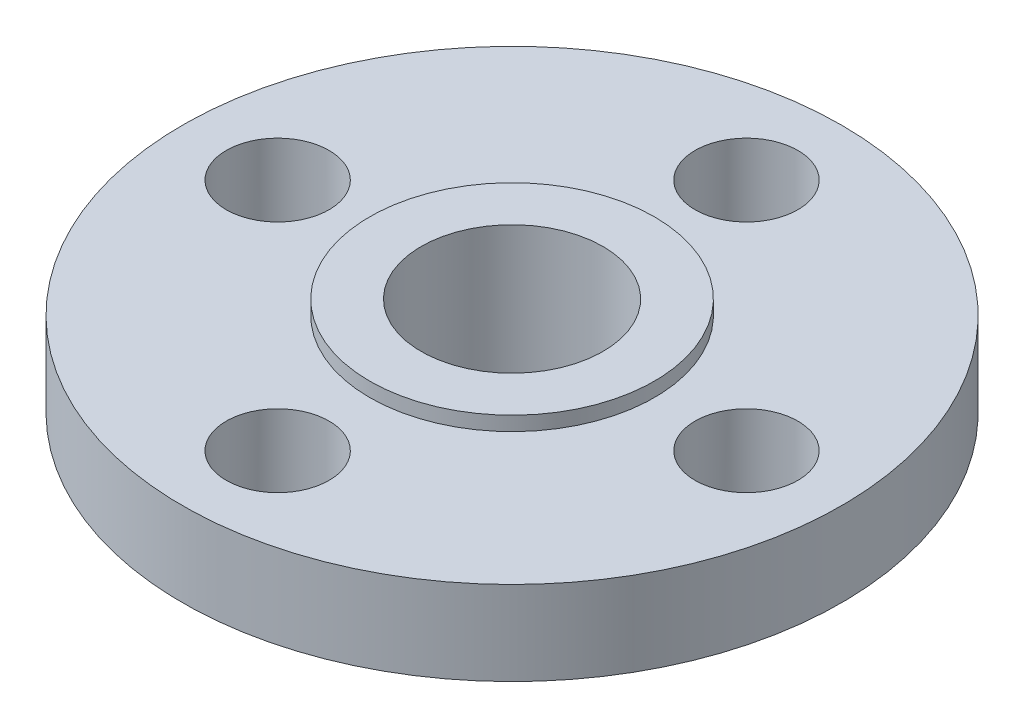
ISO-10303-21;
HEADER;
FILE_DESCRIPTION(('STEP AP214'),'2;1');
FILE_NAME('part.step','',(''),(''),'','','');
FILE_SCHEMA(('AUTOMOTIVE_DESIGN { 1 0 10303 214 1 1 1 1 }'));
ENDSEC;
DATA;
#1=APPLICATION_CONTEXT('core data for automotive mechanical design processes');
#2=APPLICATION_PROTOCOL_DEFINITION('international standard','automotive_design',2000,#1);
#3=PRODUCT_CONTEXT('',#1,'mechanical');
#4=PRODUCT('Part','Part','',(#3));
#5=PRODUCT_RELATED_PRODUCT_CATEGORY('part','',(#4));
#6=PRODUCT_DEFINITION_FORMATION('','',#4);
#7=PRODUCT_DEFINITION_CONTEXT('part definition',#1,'design');
#8=PRODUCT_DEFINITION('design','',#6,#7);
#9=PRODUCT_DEFINITION_SHAPE('','',#8);
#10=(LENGTH_UNIT() NAMED_UNIT(*) SI_UNIT(.MILLI.,.METRE.));
#11=(NAMED_UNIT(*) PLANE_ANGLE_UNIT() SI_UNIT($,.RADIAN.));
#12=(NAMED_UNIT(*) SI_UNIT($,.STERADIAN.) SOLID_ANGLE_UNIT());
#13=UNCERTAINTY_MEASURE_WITH_UNIT(LENGTH_MEASURE(1.E-05),#10,'distance_accuracy_value','');
#14=(GEOMETRIC_REPRESENTATION_CONTEXT(3) GLOBAL_UNCERTAINTY_ASSIGNED_CONTEXT((#13)) GLOBAL_UNIT_ASSIGNED_CONTEXT((#10,
#11,#12)) REPRESENTATION_CONTEXT('',''));
#15=CARTESIAN_POINT('',(0.,0.,0.));
#16=DIRECTION('',(0.,0.,1.));
#17=DIRECTION('',(1.,0.,0.));
#18=AXIS2_PLACEMENT_3D('',#15,#16,#17);
#19=CARTESIAN_POINT('',(0.,0.,0.));
#20=DIRECTION('',(0.,-1.,0.));
#21=DIRECTION('',(0.,0.,-1.));
#22=AXIS2_PLACEMENT_3D('',#19,#20,#21);
#23=CYLINDRICAL_SURFACE('',#22,35.);
#24=CARTESIAN_POINT('',(0.,0.,0.));
#25=DIRECTION('',(0.,-1.,0.));
#26=DIRECTION('',(0.,0.,-1.));
#27=AXIS2_PLACEMENT_3D('',#24,#25,#26);
#28=CIRCLE('',#27,35.);
#29=CARTESIAN_POINT('',(-34.9352080989876,0.,-2.12866979130851));
#30=VERTEX_POINT('',#29);
#31=CARTESIAN_POINT('',(-2.12866979130833,0.,-34.9352080989876));
#32=VERTEX_POINT('',#31);
#33=EDGE_CURVE('E146',#30,#32,#28,.T.);
#34=ORIENTED_EDGE('',*,*,#33,.F.);
#35=DIRECTION('',(0.,1.,0.));
#36=VECTOR('',#35,1.);
#37=CARTESIAN_POINT('',(-34.9352080989876,11.15,-2.12866979130841));
#38=LINE('',#37,#36);
#39=CARTESIAN_POINT('',(-34.9352080989876,6.35,-2.12866979130841));
#40=VERTEX_POINT('',#39);
#41=EDGE_CURVE('E245',#30,#40,#38,.T.);
#42=ORIENTED_EDGE('',*,*,#41,.T.);
#43=CARTESIAN_POINT('',(0.,6.35,0.));
#44=DIRECTION('',(0.,-1.,0.));
#45=DIRECTION('',(0.,0.,-1.));
#46=AXIS2_PLACEMENT_3D('',#43,#44,#45);
#47=CIRCLE('',#46,35.);
#48=CARTESIAN_POINT('',(-2.12866979130828,6.35,-34.9352080989876));
#49=VERTEX_POINT('',#48);
#50=EDGE_CURVE('E280',#40,#49,#47,.T.);
#51=ORIENTED_EDGE('',*,*,#50,.T.);
#52=DIRECTION('',(0.,1.,0.));
#53=VECTOR('',#52,1.);
#54=CARTESIAN_POINT('',(-2.12866979130829,11.15,-34.9352080989876));
#55=LINE('',#54,#53);
#56=EDGE_CURVE('E61',#49,#32,#55,.F.);
#57=ORIENTED_EDGE('',*,*,#56,.T.);
#58=EDGE_LOOP('',(#34,#42,#51,#57));
#59=FACE_BOUND('',#58,.T.);
#60=ADVANCED_FACE('F45',(#59),#23,.T.);
#61=CARTESIAN_POINT('',(2.12866979130857,0.,-34.9352080989876));
#62=VERTEX_POINT('',#61);
#63=CARTESIAN_POINT('',(34.9352080989876,0.,-2.12866979130826));
#64=VERTEX_POINT('',#63);
#65=EDGE_CURVE('E140',#62,#64,#28,.T.);
#66=ORIENTED_EDGE('',*,*,#65,.F.);
#67=DIRECTION('',(0.,1.,0.));
#68=VECTOR('',#67,1.);
#69=CARTESIAN_POINT('',(2.12866979130853,11.15,-34.9352080989876));
#70=LINE('',#69,#68);
#71=CARTESIAN_POINT('',(2.12866979130853,6.35,-34.9352080989876));
#72=VERTEX_POINT('',#71);
#73=EDGE_CURVE('E259',#62,#72,#70,.T.);
#74=ORIENTED_EDGE('',*,*,#73,.T.);
#75=CARTESIAN_POINT('',(34.9352080989877,6.35,-2.12866979130816));
#76=VERTEX_POINT('',#75);
#77=EDGE_CURVE('E149',#72,#76,#47,.T.);
#78=ORIENTED_EDGE('',*,*,#77,.T.);
#79=DIRECTION('',(0.,1.,0.));
#80=VECTOR('',#79,1.);
#81=CARTESIAN_POINT('',(34.9352080989876,11.15,-2.12866979130817));
#82=LINE('',#81,#80);
#83=EDGE_CURVE('E307',#76,#64,#82,.F.);
#84=ORIENTED_EDGE('',*,*,#83,.T.);
#85=EDGE_LOOP('',(#66,#74,#78,#84));
#86=FACE_BOUND('',#85,.T.);
#87=ADVANCED_FACE('F196',(#86),#23,.T.);
#88=CARTESIAN_POINT('',(34.9352080989876,0.,2.12866979130875));
#89=VERTEX_POINT('',#88);
#90=CARTESIAN_POINT('',(2.12866979130813,0.,34.9352080989877));
#91=VERTEX_POINT('',#90);
#92=EDGE_CURVE('E129',#89,#91,#28,.T.);
#93=ORIENTED_EDGE('',*,*,#92,.F.);
#94=DIRECTION('',(0.,1.,0.));
#95=VECTOR('',#94,1.);
#96=CARTESIAN_POINT('',(34.9352080989876,11.15,2.12866979130866));
#97=LINE('',#96,#95);
#98=CARTESIAN_POINT('',(34.9352080989876,6.35,2.12866979130865));
#99=VERTEX_POINT('',#98);
#100=EDGE_CURVE('E302',#89,#99,#97,.T.);
#101=ORIENTED_EDGE('',*,*,#100,.T.);
#102=CARTESIAN_POINT('',(2.12866979130804,6.35,34.9352080989877));
#103=VERTEX_POINT('',#102);
#104=EDGE_CURVE('E131',#99,#103,#47,.T.);
#105=ORIENTED_EDGE('',*,*,#104,.T.);
#106=DIRECTION('',(0.,1.,0.));
#107=VECTOR('',#106,1.);
#108=CARTESIAN_POINT('',(2.12866979130805,11.15,34.9352080989876));
#109=LINE('',#108,#107);
#110=EDGE_CURVE('E113',#103,#91,#109,.F.);
#111=ORIENTED_EDGE('',*,*,#110,.T.);
#112=EDGE_LOOP('',(#93,#101,#105,#111));
#113=FACE_BOUND('',#112,.T.);
#114=ADVANCED_FACE('F127',(#113),#23,.T.);
#115=CARTESIAN_POINT('',(0.,0.,0.));
#116=DIRECTION('',(0.,-1.,0.));
#117=DIRECTION('',(0.,0.,-1.));
#118=AXIS2_PLACEMENT_3D('',#115,#116,#117);
#119=CYLINDRICAL_SURFACE('',#118,17.25);
#120=CARTESIAN_POINT('',(0.,25.,0.));
#121=DIRECTION('',(0.,-1.,0.));
#122=DIRECTION('',(0.,0.,-1.));
#123=AXIS2_PLACEMENT_3D('',#120,#121,#122);
#124=CIRCLE('',#123,17.25);
#125=CARTESIAN_POINT('',(0.,25.,-17.25));
#126=VERTEX_POINT('',#125);
#127=EDGE_CURVE('E257',#126,#126,#124,.T.);
#128=ORIENTED_EDGE('',*,*,#127,.F.);
#129=EDGE_LOOP('',(#128));
#130=FACE_BOUND('',#129,.T.);
#131=CARTESIAN_POINT('',(0.,0.,0.));
#132=DIRECTION('',(0.,-1.,0.));
#133=DIRECTION('',(0.,0.,-1.));
#134=AXIS2_PLACEMENT_3D('',#131,#132,#133);
#135=CIRCLE('',#134,17.25);
#136=CARTESIAN_POINT('',(0.,0.,-17.25));
#137=VERTEX_POINT('',#136);
#138=EDGE_CURVE('E11',#137,#137,#135,.T.);
#139=ORIENTED_EDGE('',*,*,#138,.T.);
#140=EDGE_LOOP('',(#139));
#141=FACE_BOUND('',#140,.T.);
#142=ADVANCED_FACE('F47',(#130,#141),#119,.F.);
#143=CARTESIAN_POINT('',(-17.25,0.,0.));
#144=DIRECTION('',(0.,1.,0.));
#145=DIRECTION('',(0.,0.,1.));
#146=AXIS2_PLACEMENT_3D('',#143,#144,#145);
#147=PLANE('',#146);
#148=ORIENTED_EDGE('',*,*,#138,.F.);
#149=EDGE_LOOP('',(#148));
#150=FACE_BOUND('',#149,.T.);
#151=CARTESIAN_POINT('',(0.,0.,0.));
#152=DIRECTION('',(0.,-1.,0.));
#153=DIRECTION('',(0.,0.,-1.));
#154=AXIS2_PLACEMENT_3D('',#151,#152,#153);
#155=CIRCLE('',#154,21.4596460176991);
#156=CARTESIAN_POINT('',(0.,0.,-21.4596460176991));
#157=VERTEX_POINT('',#156);
#158=EDGE_CURVE('E54',#157,#157,#155,.T.);
#159=ORIENTED_EDGE('',*,*,#158,.T.);
#160=EDGE_LOOP('',(#159));
#161=FACE_BOUND('',#160,.T.);
#162=ADVANCED_FACE('F165',(#150,#161),#147,.F.);
#163=CARTESIAN_POINT('',(0.,5.84520581942299,0.));
#164=DIRECTION('',(0.,1.,0.));
#165=DIRECTION('',(0.,0.,1.));
#166=AXIS2_PLACEMENT_3D('',#163,#164,#165);
#167=CONICAL_SURFACE('',#166,23.940788683606,0.4014257279587);
#168=ORIENTED_EDGE('',*,*,#158,.F.);
#169=EDGE_LOOP('',(#168));
#170=FACE_BOUND('',#169,.T.);
#171=CARTESIAN_POINT('',(0.,5.84520581942299,0.));
#172=DIRECTION('',(0.,-1.,0.));
#173=DIRECTION('',(0.,0.,-1.));
#174=AXIS2_PLACEMENT_3D('',#171,#172,#173);
#175=CIRCLE('',#174,23.940788683606);
#176=CARTESIAN_POINT('',(0.,5.84520581942299,-23.940788683606));
#177=VERTEX_POINT('',#176);
#178=EDGE_CURVE('E158',#177,#177,#175,.T.);
#179=ORIENTED_EDGE('',*,*,#178,.T.);
#180=EDGE_LOOP('',(#179));
#181=FACE_BOUND('',#180,.T.);
#182=ADVANCED_FACE('F167',(#170,#181),#167,.T.);
#183=CARTESIAN_POINT('',(-23.940788683606,5.84520581942299,0.));
#184=DIRECTION('',(0.,1.,0.));
#185=DIRECTION('',(0.,0.,1.));
#186=AXIS2_PLACEMENT_3D('',#183,#184,#185);
#187=PLANE('',#186);
#188=ORIENTED_EDGE('',*,*,#178,.F.);
#189=EDGE_LOOP('',(#188));
#190=FACE_BOUND('',#189,.T.);
#191=CARTESIAN_POINT('',(0.,5.84520581942299,0.));
#192=DIRECTION('',(0.,-1.,0.));
#193=DIRECTION('',(0.,0.,-1.));
#194=AXIS2_PLACEMENT_3D('',#191,#192,#193);
#195=CIRCLE('',#194,27.7185033517922);
#196=CARTESIAN_POINT('',(0.,5.84520581942299,-27.7185033517922));
#197=VERTEX_POINT('',#196);
#198=EDGE_CURVE('E154',#197,#197,#195,.T.);
#199=ORIENTED_EDGE('',*,*,#198,.T.);
#200=EDGE_LOOP('',(#199));
#201=FACE_BOUND('',#200,.T.);
#202=ADVANCED_FACE('F170',(#190,#201),#187,.F.);
#203=CARTESIAN_POINT('',(0.,0.,0.));
#204=DIRECTION('',(0.,-1.,0.));
#205=DIRECTION('',(0.,0.,-1.));
#206=AXIS2_PLACEMENT_3D('',#203,#204,#205);
#207=CONICAL_SURFACE('',#206,30.1996460176991,0.401425727958693);
#208=ORIENTED_EDGE('',*,*,#198,.F.);
#209=EDGE_LOOP('',(#208));
#210=FACE_BOUND('',#209,.T.);
#211=CARTESIAN_POINT('',(0.,0.,0.));
#212=DIRECTION('',(0.,-1.,0.));
#213=DIRECTION('',(0.,0.,-1.));
#214=AXIS2_PLACEMENT_3D('',#211,#212,#213);
#215=CIRCLE('',#214,30.1996460176991);
#216=CARTESIAN_POINT('',(0.,0.,-30.1996460176991));
#217=VERTEX_POINT('',#216);
#218=EDGE_CURVE('E145',#217,#217,#215,.T.);
#219=ORIENTED_EDGE('',*,*,#218,.T.);
#220=EDGE_LOOP('',(#219));
#221=FACE_BOUND('',#220,.T.);
#222=ADVANCED_FACE('F176',(#210,#221),#207,.F.);
#223=CARTESIAN_POINT('',(-30.1996460176991,0.,0.));
#224=DIRECTION('',(0.,1.,0.));
#225=DIRECTION('',(0.,0.,1.));
#226=AXIS2_PLACEMENT_3D('',#223,#224,#225);
#227=PLANE('',#226);
#228=ORIENTED_EDGE('',*,*,#218,.F.);
#229=EDGE_LOOP('',(#228));
#230=FACE_BOUND('',#229,.T.);
#231=CARTESIAN_POINT('',(-2.12866979130887,0.,34.9352080989876));
#232=VERTEX_POINT('',#231);
#233=CARTESIAN_POINT('',(-34.9352080989876,0.,2.12866979130851));
#234=VERTEX_POINT('',#233);
#235=EDGE_CURVE('E141',#232,#234,#28,.T.);
#236=ORIENTED_EDGE('',*,*,#235,.T.);
#237=CARTESIAN_POINT('',(-44.45,0.,0.));
#238=DIRECTION('',(0.,1.,0.));
#239=DIRECTION('',(0.,0.,1.));
#240=AXIS2_PLACEMENT_3D('',#237,#238,#239);
#241=CIRCLE('',#240,9.75);
#242=EDGE_CURVE('E243',#234,#30,#241,.T.);
#243=ORIENTED_EDGE('',*,*,#242,.T.);
#244=ORIENTED_EDGE('',*,*,#33,.T.);
#245=CARTESIAN_POINT('',(1.55196345511577E-13,0.,-44.45));
#246=DIRECTION('',(0.,1.,0.));
#247=DIRECTION('',(0.,0.,1.));
#248=AXIS2_PLACEMENT_3D('',#245,#246,#247);
#249=CIRCLE('',#248,9.75);
#250=EDGE_CURVE('E295',#32,#62,#249,.T.);
#251=ORIENTED_EDGE('',*,*,#250,.T.);
#252=ORIENTED_EDGE('',*,*,#65,.T.);
#253=CARTESIAN_POINT('',(44.45,0.,3.10392691023155E-13));
#254=DIRECTION('',(0.,1.,0.));
#255=DIRECTION('',(0.,0.,1.));
#256=AXIS2_PLACEMENT_3D('',#253,#254,#255);
#257=CIRCLE('',#256,9.75);
#258=EDGE_CURVE('E138',#64,#89,#257,.T.);
#259=ORIENTED_EDGE('',*,*,#258,.T.);
#260=ORIENTED_EDGE('',*,*,#92,.T.);
#261=CARTESIAN_POINT('',(-4.65589036534732E-13,0.,44.45));
#262=DIRECTION('',(0.,1.,0.));
#263=DIRECTION('',(0.,0.,1.));
#264=AXIS2_PLACEMENT_3D('',#261,#262,#263);
#265=CIRCLE('',#264,9.75);
#266=EDGE_CURVE('E110',#91,#232,#265,.T.);
#267=ORIENTED_EDGE('',*,*,#266,.T.);
#268=EDGE_LOOP('',(#236,#243,#244,#251,#252,#259,#260,#267));
#269=FACE_BOUND('',#268,.T.);
#270=ADVANCED_FACE('F136',(#230,#269),#227,.F.);
#271=CARTESIAN_POINT('',(-2.12866979130877,6.35,34.9352080989876));
#272=VERTEX_POINT('',#271);
#273=CARTESIAN_POINT('',(-34.9352080989876,6.35,2.12866979130841));
#274=VERTEX_POINT('',#273);
#275=EDGE_CURVE('E251',#272,#274,#47,.T.);
#276=ORIENTED_EDGE('',*,*,#275,.T.);
#277=DIRECTION('',(0.,1.,0.));
#278=VECTOR('',#277,1.);
#279=CARTESIAN_POINT('',(-34.9352080989876,11.15,2.12866979130841));
#280=LINE('',#279,#278);
#281=EDGE_CURVE('E69',#274,#234,#280,.F.);
#282=ORIENTED_EDGE('',*,*,#281,.T.);
#283=ORIENTED_EDGE('',*,*,#235,.F.);
#284=DIRECTION('',(0.,1.,0.));
#285=VECTOR('',#284,1.);
#286=CARTESIAN_POINT('',(-2.12866979130878,11.15,34.9352080989876));
#287=LINE('',#286,#285);
#288=EDGE_CURVE('E116',#232,#272,#287,.T.);
#289=ORIENTED_EDGE('',*,*,#288,.T.);
#290=EDGE_LOOP('',(#276,#282,#283,#289));
#291=FACE_BOUND('',#290,.T.);
#292=ADVANCED_FACE('F186',(#291),#23,.T.);
#293=CARTESIAN_POINT('',(-35.,6.35,0.));
#294=DIRECTION('',(0.,1.,0.));
#295=DIRECTION('',(0.,0.,1.));
#296=AXIS2_PLACEMENT_3D('',#293,#294,#295);
#297=PLANE('',#296);
#298=ORIENTED_EDGE('',*,*,#50,.F.);
#299=CARTESIAN_POINT('',(-44.45,6.35,0.));
#300=DIRECTION('',(0.,1.,0.));
#301=DIRECTION('',(0.,0.,1.));
#302=AXIS2_PLACEMENT_3D('',#299,#300,#301);
#303=CIRCLE('',#302,9.75);
#304=EDGE_CURVE('E253',#40,#274,#303,.T.);
#305=ORIENTED_EDGE('',*,*,#304,.T.);
#306=ORIENTED_EDGE('',*,*,#275,.F.);
#307=CARTESIAN_POINT('',(-4.65589036534732E-13,6.35,44.45));
#308=DIRECTION('',(0.,1.,0.));
#309=DIRECTION('',(0.,0.,1.));
#310=AXIS2_PLACEMENT_3D('',#307,#308,#309);
#311=CIRCLE('',#310,9.75);
#312=EDGE_CURVE('E133',#272,#103,#311,.T.);
#313=ORIENTED_EDGE('',*,*,#312,.T.);
#314=ORIENTED_EDGE('',*,*,#104,.F.);
#315=CARTESIAN_POINT('',(44.45,6.35,3.10392691023155E-13));
#316=DIRECTION('',(0.,1.,0.));
#317=DIRECTION('',(0.,0.,1.));
#318=AXIS2_PLACEMENT_3D('',#315,#316,#317);
#319=CIRCLE('',#318,9.75);
#320=EDGE_CURVE('E310',#99,#76,#319,.T.);
#321=ORIENTED_EDGE('',*,*,#320,.T.);
#322=ORIENTED_EDGE('',*,*,#77,.F.);
#323=CARTESIAN_POINT('',(1.55196345511577E-13,6.35,-44.45));
#324=DIRECTION('',(0.,1.,0.));
#325=DIRECTION('',(0.,0.,1.));
#326=AXIS2_PLACEMENT_3D('',#323,#324,#325);
#327=CIRCLE('',#326,9.75);
#328=EDGE_CURVE('E298',#72,#49,#327,.T.);
#329=ORIENTED_EDGE('',*,*,#328,.T.);
#330=EDGE_LOOP('',(#298,#305,#306,#313,#314,#321,#322,#329));
#331=FACE_BOUND('',#330,.T.);
#332=CARTESIAN_POINT('',(0.,6.35,0.));
#333=DIRECTION('',(0.,-1.,0.));
#334=DIRECTION('',(0.,0.,-1.));
#335=AXIS2_PLACEMENT_3D('',#332,#333,#334);
#336=CIRCLE('',#335,62.5);
#337=CARTESIAN_POINT('',(0.,6.35,-62.5));
#338=VERTEX_POINT('',#337);
#339=EDGE_CURVE('E277',#338,#338,#336,.T.);
#340=ORIENTED_EDGE('',*,*,#339,.T.);
#341=EDGE_LOOP('',(#340));
#342=FACE_BOUND('',#341,.T.);
#343=ADVANCED_FACE('F192',(#331,#342),#297,.F.);
#344=CARTESIAN_POINT('',(0.,0.,0.));
#345=DIRECTION('',(0.,-1.,0.));
#346=DIRECTION('',(0.,0.,-1.));
#347=AXIS2_PLACEMENT_3D('',#344,#345,#346);
#348=CYLINDRICAL_SURFACE('',#347,62.5);
#349=ORIENTED_EDGE('',*,*,#339,.F.);
#350=EDGE_LOOP('',(#349));
#351=FACE_BOUND('',#350,.T.);
#352=CARTESIAN_POINT('',(0.,22.3,0.));
#353=DIRECTION('',(0.,-1.,0.));
#354=DIRECTION('',(0.,0.,-1.));
#355=AXIS2_PLACEMENT_3D('',#352,#353,#354);
#356=CIRCLE('',#355,62.5);
#357=CARTESIAN_POINT('',(0.,22.3,-62.5));
#358=VERTEX_POINT('',#357);
#359=EDGE_CURVE('E274',#358,#358,#356,.T.);
#360=ORIENTED_EDGE('',*,*,#359,.T.);
#361=EDGE_LOOP('',(#360));
#362=FACE_BOUND('',#361,.T.);
#363=ADVANCED_FACE('F207',(#351,#362),#348,.T.);
#364=CARTESIAN_POINT('',(-62.5,22.3,0.));
#365=DIRECTION('',(0.,-1.,0.));
#366=DIRECTION('',(0.,0.,-1.));
#367=AXIS2_PLACEMENT_3D('',#364,#365,#366);
#368=PLANE('',#367);
#369=CARTESIAN_POINT('',(-44.45,22.3,0.));
#370=DIRECTION('',(0.,1.,0.));
#371=DIRECTION('',(0.,0.,1.));
#372=AXIS2_PLACEMENT_3D('',#369,#370,#371);
#373=CIRCLE('',#372,9.75);
#374=CARTESIAN_POINT('',(-44.45,22.3,9.75));
#375=VERTEX_POINT('',#374);
#376=EDGE_CURVE('E241',#375,#375,#373,.T.);
#377=ORIENTED_EDGE('',*,*,#376,.F.);
#378=EDGE_LOOP('',(#377));
#379=FACE_BOUND('',#378,.T.);
#380=CARTESIAN_POINT('',(1.55196345511577E-13,22.3,-44.45));
#381=DIRECTION('',(0.,1.,0.));
#382=DIRECTION('',(0.,0.,1.));
#383=AXIS2_PLACEMENT_3D('',#380,#381,#382);
#384=CIRCLE('',#383,9.75);
#385=CARTESIAN_POINT('',(1.55196345511577E-13,22.3,-34.7));
#386=VERTEX_POINT('',#385);
#387=EDGE_CURVE('E329',#386,#386,#384,.T.);
#388=ORIENTED_EDGE('',*,*,#387,.F.);
#389=EDGE_LOOP('',(#388));
#390=FACE_BOUND('',#389,.T.);
#391=CARTESIAN_POINT('',(44.45,22.3,3.10392691023155E-13));
#392=DIRECTION('',(0.,1.,0.));
#393=DIRECTION('',(0.,0.,1.));
#394=AXIS2_PLACEMENT_3D('',#391,#392,#393);
#395=CIRCLE('',#394,9.75);
#396=CARTESIAN_POINT('',(44.45,22.3,9.75000000000031));
#397=VERTEX_POINT('',#396);
#398=EDGE_CURVE('E323',#397,#397,#395,.T.);
#399=ORIENTED_EDGE('',*,*,#398,.F.);
#400=EDGE_LOOP('',(#399));
#401=FACE_BOUND('',#400,.T.);
#402=CARTESIAN_POINT('',(-4.65589036534732E-13,22.3,44.45));
#403=DIRECTION('',(0.,1.,0.));
#404=DIRECTION('',(0.,0.,1.));
#405=AXIS2_PLACEMENT_3D('',#402,#403,#404);
#406=CIRCLE('',#405,9.75);
#407=CARTESIAN_POINT('',(-4.65589036534732E-13,22.3,54.2));
#408=VERTEX_POINT('',#407);
#409=EDGE_CURVE('E122',#408,#408,#406,.T.);
#410=ORIENTED_EDGE('',*,*,#409,.F.);
#411=EDGE_LOOP('',(#410));
#412=FACE_BOUND('',#411,.T.);
#413=ORIENTED_EDGE('',*,*,#359,.F.);
#414=EDGE_LOOP('',(#413));
#415=FACE_BOUND('',#414,.T.);
#416=CARTESIAN_POINT('',(0.,22.3,0.));
#417=DIRECTION('',(0.,-1.,0.));
#418=DIRECTION('',(0.,0.,-1.));
#419=AXIS2_PLACEMENT_3D('',#416,#417,#418);
#420=CIRCLE('',#419,27.);
#421=CARTESIAN_POINT('',(0.,22.3,-27.));
#422=VERTEX_POINT('',#421);
#423=EDGE_CURVE('E270',#422,#422,#420,.T.);
#424=ORIENTED_EDGE('',*,*,#423,.T.);
#425=EDGE_LOOP('',(#424));
#426=FACE_BOUND('',#425,.T.);
#427=ADVANCED_FACE('F211',(#379,#390,#401,#412,#415,#426),#368,.F.);
#428=CARTESIAN_POINT('',(0.,0.,0.));
#429=DIRECTION('',(0.,-1.,0.));
#430=DIRECTION('',(0.,0.,-1.));
#431=AXIS2_PLACEMENT_3D('',#428,#429,#430);
#432=CYLINDRICAL_SURFACE('',#431,27.);
#433=ORIENTED_EDGE('',*,*,#423,.F.);
#434=EDGE_LOOP('',(#433));
#435=FACE_BOUND('',#434,.T.);
#436=CARTESIAN_POINT('',(0.,25.,0.));
#437=DIRECTION('',(0.,-1.,0.));
#438=DIRECTION('',(0.,0.,-1.));
#439=AXIS2_PLACEMENT_3D('',#436,#437,#438);
#440=CIRCLE('',#439,27.);
#441=CARTESIAN_POINT('',(0.,25.,-27.));
#442=VERTEX_POINT('',#441);
#443=EDGE_CURVE('E266',#442,#442,#440,.T.);
#444=ORIENTED_EDGE('',*,*,#443,.T.);
#445=EDGE_LOOP('',(#444));
#446=FACE_BOUND('',#445,.T.);
#447=ADVANCED_FACE('F215',(#435,#446),#432,.T.);
#448=CARTESIAN_POINT('',(-27.,25.,0.));
#449=DIRECTION('',(0.,-1.,0.));
#450=DIRECTION('',(0.,0.,-1.));
#451=AXIS2_PLACEMENT_3D('',#448,#449,#450);
#452=PLANE('',#451);
#453=ORIENTED_EDGE('',*,*,#443,.F.);
#454=EDGE_LOOP('',(#453));
#455=FACE_BOUND('',#454,.T.);
#456=ORIENTED_EDGE('',*,*,#127,.T.);
#457=EDGE_LOOP('',(#456));
#458=FACE_BOUND('',#457,.T.);
#459=ADVANCED_FACE('F219',(#455,#458),#452,.F.);
#460=CARTESIAN_POINT('',(-4.65589036534732E-13,0.,44.45));
#461=DIRECTION('',(0.,1.,0.));
#462=DIRECTION('',(0.,0.,1.));
#463=AXIS2_PLACEMENT_3D('',#460,#461,#462);
#464=CYLINDRICAL_SURFACE('',#463,9.75);
#465=ORIENTED_EDGE('',*,*,#409,.T.);
#466=EDGE_LOOP('',(#465));
#467=FACE_BOUND('',#466,.T.);
#468=ORIENTED_EDGE('',*,*,#266,.F.);
#469=ORIENTED_EDGE('',*,*,#110,.F.);
#470=ORIENTED_EDGE('',*,*,#312,.F.);
#471=ORIENTED_EDGE('',*,*,#288,.F.);
#472=EDGE_LOOP('',(#468,#469,#470,#471));
#473=FACE_BOUND('',#472,.T.);
#474=ADVANCED_FACE('F112',(#467,#473),#464,.F.);
#475=CARTESIAN_POINT('',(44.45,0.,3.10392691023155E-13));
#476=DIRECTION('',(0.,1.,0.));
#477=DIRECTION('',(0.,0.,1.));
#478=AXIS2_PLACEMENT_3D('',#475,#476,#477);
#479=CYLINDRICAL_SURFACE('',#478,9.75);
#480=ORIENTED_EDGE('',*,*,#398,.T.);
#481=EDGE_LOOP('',(#480));
#482=FACE_BOUND('',#481,.T.);
#483=ORIENTED_EDGE('',*,*,#258,.F.);
#484=ORIENTED_EDGE('',*,*,#83,.F.);
#485=ORIENTED_EDGE('',*,*,#320,.F.);
#486=ORIENTED_EDGE('',*,*,#100,.F.);
#487=EDGE_LOOP('',(#483,#484,#485,#486));
#488=FACE_BOUND('',#487,.T.);
#489=ADVANCED_FACE('F225',(#482,#488),#479,.F.);
#490=CARTESIAN_POINT('',(1.55196345511577E-13,0.,-44.45));
#491=DIRECTION('',(0.,1.,0.));
#492=DIRECTION('',(0.,0.,1.));
#493=AXIS2_PLACEMENT_3D('',#490,#491,#492);
#494=CYLINDRICAL_SURFACE('',#493,9.75);
#495=ORIENTED_EDGE('',*,*,#387,.T.);
#496=EDGE_LOOP('',(#495));
#497=FACE_BOUND('',#496,.T.);
#498=ORIENTED_EDGE('',*,*,#250,.F.);
#499=ORIENTED_EDGE('',*,*,#56,.F.);
#500=ORIENTED_EDGE('',*,*,#328,.F.);
#501=ORIENTED_EDGE('',*,*,#73,.F.);
#502=EDGE_LOOP('',(#498,#499,#500,#501));
#503=FACE_BOUND('',#502,.T.);
#504=ADVANCED_FACE('F229',(#497,#503),#494,.F.);
#505=CARTESIAN_POINT('',(-44.45,0.,0.));
#506=DIRECTION('',(0.,1.,0.));
#507=DIRECTION('',(0.,0.,1.));
#508=AXIS2_PLACEMENT_3D('',#505,#506,#507);
#509=CYLINDRICAL_SURFACE('',#508,9.75);
#510=ORIENTED_EDGE('',*,*,#376,.T.);
#511=EDGE_LOOP('',(#510));
#512=FACE_BOUND('',#511,.T.);
#513=ORIENTED_EDGE('',*,*,#242,.F.);
#514=ORIENTED_EDGE('',*,*,#281,.F.);
#515=ORIENTED_EDGE('',*,*,#304,.F.);
#516=ORIENTED_EDGE('',*,*,#41,.F.);
#517=EDGE_LOOP('',(#513,#514,#515,#516));
#518=FACE_BOUND('',#517,.T.);
#519=ADVANCED_FACE('F233',(#512,#518),#509,.F.);
#520=CLOSED_SHELL('',(#60,#87,#114,#142,#162,#182,#202,#222,#270,#292,#343,#363,#427,#447,#459,
#474,#489,#504,#519));
#521=MANIFOLD_SOLID_BREP('B2',#520);
#522=ADVANCED_BREP_SHAPE_REPRESENTATION('',(#18,#521),#14);
#523=SHAPE_DEFINITION_REPRESENTATION(#9,#522);
ENDSEC;
END-ISO-10303-21;
